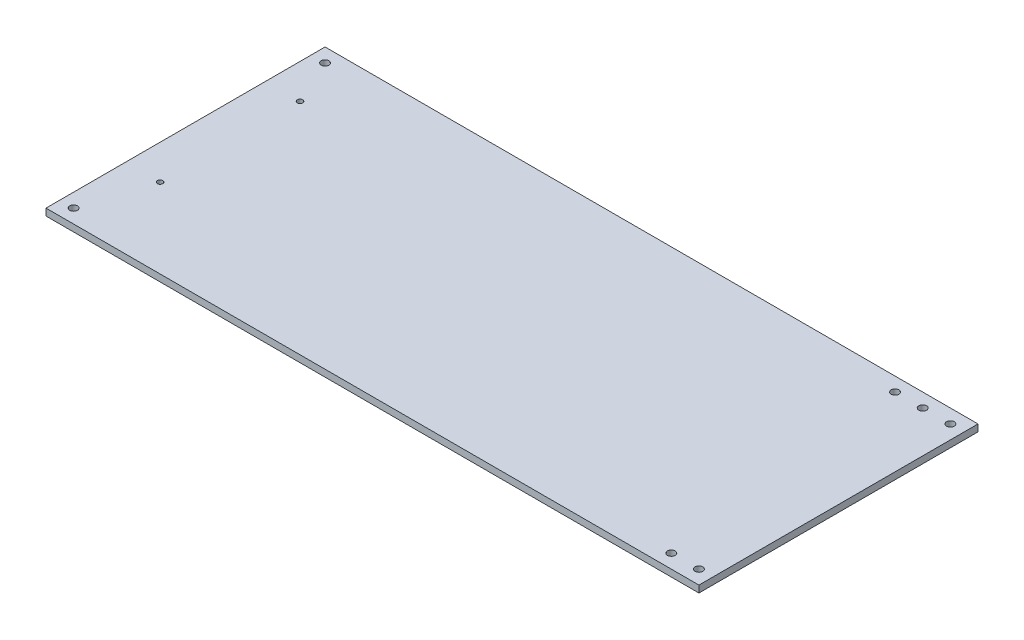
ISO-10303-21;
HEADER;
FILE_DESCRIPTION(('STEP AP214'),'2;1');
FILE_NAME('part.step','',(''),(''),'','','');
FILE_SCHEMA(('AUTOMOTIVE_DESIGN { 1 0 10303 214 1 1 1 1 }'));
ENDSEC;
DATA;
#1=APPLICATION_CONTEXT('core data for automotive mechanical design processes');
#2=APPLICATION_PROTOCOL_DEFINITION('international standard','automotive_design',2000,#1);
#3=PRODUCT_CONTEXT('',#1,'mechanical');
#4=PRODUCT('Part','Part','',(#3));
#5=PRODUCT_RELATED_PRODUCT_CATEGORY('part','',(#4));
#6=PRODUCT_DEFINITION_FORMATION('','',#4);
#7=PRODUCT_DEFINITION_CONTEXT('part definition',#1,'design');
#8=PRODUCT_DEFINITION('design','',#6,#7);
#9=PRODUCT_DEFINITION_SHAPE('','',#8);
#10=(LENGTH_UNIT() NAMED_UNIT(*) SI_UNIT(.MILLI.,.METRE.));
#11=(NAMED_UNIT(*) PLANE_ANGLE_UNIT() SI_UNIT($,.RADIAN.));
#12=(NAMED_UNIT(*) SI_UNIT($,.STERADIAN.) SOLID_ANGLE_UNIT());
#13=UNCERTAINTY_MEASURE_WITH_UNIT(LENGTH_MEASURE(1.E-05),#10,'distance_accuracy_value','');
#14=(GEOMETRIC_REPRESENTATION_CONTEXT(3) GLOBAL_UNCERTAINTY_ASSIGNED_CONTEXT((#13)) GLOBAL_UNIT_ASSIGNED_CONTEXT((#10,
#11,#12)) REPRESENTATION_CONTEXT('',''));
#15=CARTESIAN_POINT('',(0.,0.,0.));
#16=DIRECTION('',(0.,0.,1.));
#17=DIRECTION('',(1.,0.,0.));
#18=AXIS2_PLACEMENT_3D('',#15,#16,#17);
#19=CARTESIAN_POINT('',(0.,25.4,-150.));
#20=DIRECTION('',(0.,0.,1.));
#21=DIRECTION('',(1.,0.,0.));
#22=AXIS2_PLACEMENT_3D('',#19,#20,#21);
#23=PLANE('',#22);
#24=DIRECTION('',(-1.,0.,0.));
#25=VECTOR('',#24,1.);
#26=CARTESIAN_POINT('',(0.,19.05,-150.));
#27=LINE('',#26,#25);
#28=CARTESIAN_POINT('',(300.,19.05,-150.));
#29=VERTEX_POINT('',#28);
#30=CARTESIAN_POINT('',(-300.,19.05,-150.));
#31=VERTEX_POINT('',#30);
#32=EDGE_CURVE('E110',#29,#31,#27,.T.);
#33=ORIENTED_EDGE('',*,*,#32,.F.);
#34=DIRECTION('',(0.,-1.,0.));
#35=VECTOR('',#34,1.);
#36=CARTESIAN_POINT('',(300.,25.4,-150.));
#37=LINE('',#36,#35);
#38=CARTESIAN_POINT('',(300.,25.4,-150.));
#39=VERTEX_POINT('',#38);
#40=EDGE_CURVE('E11',#39,#29,#37,.T.);
#41=ORIENTED_EDGE('',*,*,#40,.F.);
#42=DIRECTION('',(-1.,0.,0.));
#43=VECTOR('',#42,1.);
#44=CARTESIAN_POINT('',(0.,25.4,-150.));
#45=LINE('',#44,#43);
#46=CARTESIAN_POINT('',(-300.,25.4,-150.));
#47=VERTEX_POINT('',#46);
#48=EDGE_CURVE('E95',#39,#47,#45,.T.);
#49=ORIENTED_EDGE('',*,*,#48,.T.);
#50=DIRECTION('',(0.,-1.,0.));
#51=VECTOR('',#50,1.);
#52=CARTESIAN_POINT('',(-300.,25.4,-150.));
#53=LINE('',#52,#51);
#54=EDGE_CURVE('E58',#47,#31,#53,.T.);
#55=ORIENTED_EDGE('',*,*,#54,.T.);
#56=EDGE_LOOP('',(#33,#41,#49,#55));
#57=FACE_BOUND('',#56,.T.);
#58=ADVANCED_FACE('F42',(#57),#23,.T.);
#59=CARTESIAN_POINT('',(300.,25.4,0.));
#60=DIRECTION('',(-1.,0.,0.));
#61=DIRECTION('',(0.,0.,1.));
#62=AXIS2_PLACEMENT_3D('',#59,#60,#61);
#63=PLANE('',#62);
#64=DIRECTION('',(0.,0.,-1.));
#65=VECTOR('',#64,1.);
#66=CARTESIAN_POINT('',(300.,19.05,0.));
#67=LINE('',#66,#65);
#68=CARTESIAN_POINT('',(300.,19.05,-406.45));
#69=VERTEX_POINT('',#68);
#70=EDGE_CURVE('E96',#29,#69,#67,.T.);
#71=ORIENTED_EDGE('',*,*,#70,.T.);
#72=DIRECTION('',(0.,-1.,0.));
#73=VECTOR('',#72,1.);
#74=CARTESIAN_POINT('',(300.,25.4,-406.45));
#75=LINE('',#74,#73);
#76=CARTESIAN_POINT('',(300.,25.4,-406.45));
#77=VERTEX_POINT('',#76);
#78=EDGE_CURVE('E55',#77,#69,#75,.T.);
#79=ORIENTED_EDGE('',*,*,#78,.F.);
#80=DIRECTION('',(0.,0.,-1.));
#81=VECTOR('',#80,1.);
#82=CARTESIAN_POINT('',(300.,25.4,0.));
#83=LINE('',#82,#81);
#84=EDGE_CURVE('E86',#39,#77,#83,.T.);
#85=ORIENTED_EDGE('',*,*,#84,.F.);
#86=ORIENTED_EDGE('',*,*,#40,.T.);
#87=EDGE_LOOP('',(#71,#79,#85,#86));
#88=FACE_BOUND('',#87,.T.);
#89=ADVANCED_FACE('F98',(#88),#63,.F.);
#90=CARTESIAN_POINT('',(0.,25.4,-406.45));
#91=DIRECTION('',(0.,0.,-1.));
#92=DIRECTION('',(-1.,0.,0.));
#93=AXIS2_PLACEMENT_3D('',#90,#91,#92);
#94=PLANE('',#93);
#95=DIRECTION('',(1.,0.,0.));
#96=VECTOR('',#95,1.);
#97=CARTESIAN_POINT('',(0.,19.05,-406.45));
#98=LINE('',#97,#96);
#99=CARTESIAN_POINT('',(-300.,19.05,-406.45));
#100=VERTEX_POINT('',#99);
#101=EDGE_CURVE('E111',#100,#69,#98,.T.);
#102=ORIENTED_EDGE('',*,*,#101,.F.);
#103=DIRECTION('',(0.,-1.,0.));
#104=VECTOR('',#103,1.);
#105=CARTESIAN_POINT('',(-300.,25.4,-406.45));
#106=LINE('',#105,#104);
#107=CARTESIAN_POINT('',(-300.,25.4,-406.45));
#108=VERTEX_POINT('',#107);
#109=EDGE_CURVE('E71',#108,#100,#106,.T.);
#110=ORIENTED_EDGE('',*,*,#109,.F.);
#111=DIRECTION('',(1.,0.,0.));
#112=VECTOR('',#111,1.);
#113=CARTESIAN_POINT('',(0.,25.4,-406.45));
#114=LINE('',#113,#112);
#115=EDGE_CURVE('E93',#108,#77,#114,.T.);
#116=ORIENTED_EDGE('',*,*,#115,.T.);
#117=ORIENTED_EDGE('',*,*,#78,.T.);
#118=EDGE_LOOP('',(#102,#110,#116,#117));
#119=FACE_BOUND('',#118,.T.);
#120=ADVANCED_FACE('F103',(#119),#94,.T.);
#121=CARTESIAN_POINT('',(-300.,25.4,0.));
#122=DIRECTION('',(-1.,0.,0.));
#123=DIRECTION('',(0.,0.,1.));
#124=AXIS2_PLACEMENT_3D('',#121,#122,#123);
#125=PLANE('',#124);
#126=DIRECTION('',(0.,0.,-1.));
#127=VECTOR('',#126,1.);
#128=CARTESIAN_POINT('',(-300.,19.05,0.));
#129=LINE('',#128,#127);
#130=EDGE_CURVE('E113',#31,#100,#129,.T.);
#131=ORIENTED_EDGE('',*,*,#130,.F.);
#132=ORIENTED_EDGE('',*,*,#54,.F.);
#133=DIRECTION('',(0.,0.,-1.));
#134=VECTOR('',#133,1.);
#135=CARTESIAN_POINT('',(-300.,25.4,0.));
#136=LINE('',#135,#134);
#137=EDGE_CURVE('E105',#47,#108,#136,.T.);
#138=ORIENTED_EDGE('',*,*,#137,.T.);
#139=ORIENTED_EDGE('',*,*,#109,.T.);
#140=EDGE_LOOP('',(#131,#132,#138,#139));
#141=FACE_BOUND('',#140,.T.);
#142=ADVANCED_FACE('F178',(#141),#125,.T.);
#143=CARTESIAN_POINT('',(0.,25.4,0.));
#144=DIRECTION('',(0.,1.,0.));
#145=DIRECTION('',(0.,0.,1.));
#146=AXIS2_PLACEMENT_3D('',#143,#144,#145);
#147=PLANE('',#146);
#148=CARTESIAN_POINT('',(-268.25,25.4,-351.68125));
#149=DIRECTION('',(0.,1.,0.));
#150=DIRECTION('',(0.,0.,1.));
#151=AXIS2_PLACEMENT_3D('',#148,#149,#150);
#152=CIRCLE('',#151,2.48920000000002);
#153=CARTESIAN_POINT('',(-268.25,25.4,-349.19205));
#154=VERTEX_POINT('',#153);
#155=EDGE_CURVE('E169',#154,#154,#152,.T.);
#156=ORIENTED_EDGE('',*,*,#155,.F.);
#157=EDGE_LOOP('',(#156));
#158=FACE_BOUND('',#157,.T.);
#159=CARTESIAN_POINT('',(-268.25,25.4,-223.09375));
#160=DIRECTION('',(0.,1.,0.));
#161=DIRECTION('',(0.,0.,1.));
#162=AXIS2_PLACEMENT_3D('',#159,#160,#161);
#163=CIRCLE('',#162,2.48920000000002);
#164=CARTESIAN_POINT('',(-268.25,25.4,-220.60455));
#165=VERTEX_POINT('',#164);
#166=EDGE_CURVE('E161',#165,#165,#163,.T.);
#167=ORIENTED_EDGE('',*,*,#166,.F.);
#168=EDGE_LOOP('',(#167));
#169=FACE_BOUND('',#168,.T.);
#170=CARTESIAN_POINT('',(-287.3,25.4,-393.75));
#171=DIRECTION('',(0.,1.,0.));
#172=DIRECTION('',(0.,0.,1.));
#173=AXIS2_PLACEMENT_3D('',#170,#171,#172);
#174=CIRCLE('',#173,3.56869999999998);
#175=CARTESIAN_POINT('',(-287.3,25.4,-390.1813));
#176=VERTEX_POINT('',#175);
#177=EDGE_CURVE('E160',#176,#176,#174,.T.);
#178=ORIENTED_EDGE('',*,*,#177,.F.);
#179=EDGE_LOOP('',(#178));
#180=FACE_BOUND('',#179,.T.);
#181=CARTESIAN_POINT('',(-287.3,25.4,-162.7));
#182=DIRECTION('',(0.,1.,0.));
#183=DIRECTION('',(0.,0.,1.));
#184=AXIS2_PLACEMENT_3D('',#181,#182,#183);
#185=CIRCLE('',#184,3.56869999999998);
#186=CARTESIAN_POINT('',(-287.3,25.4,-159.1313));
#187=VERTEX_POINT('',#186);
#188=EDGE_CURVE('E151',#187,#187,#185,.T.);
#189=ORIENTED_EDGE('',*,*,#188,.F.);
#190=EDGE_LOOP('',(#189));
#191=FACE_BOUND('',#190,.T.);
#192=CARTESIAN_POINT('',(261.9,25.4,-162.7));
#193=DIRECTION('',(0.,1.,0.));
#194=DIRECTION('',(0.,0.,1.));
#195=AXIS2_PLACEMENT_3D('',#192,#193,#194);
#196=CIRCLE('',#195,3.56869999999998);
#197=CARTESIAN_POINT('',(261.9,25.4,-159.1313));
#198=VERTEX_POINT('',#197);
#199=EDGE_CURVE('E143',#198,#198,#196,.T.);
#200=ORIENTED_EDGE('',*,*,#199,.F.);
#201=EDGE_LOOP('',(#200));
#202=FACE_BOUND('',#201,.T.);
#203=CARTESIAN_POINT('',(287.3,25.4,-162.7));
#204=DIRECTION('',(0.,1.,0.));
#205=DIRECTION('',(0.,0.,1.));
#206=AXIS2_PLACEMENT_3D('',#203,#204,#205);
#207=CIRCLE('',#206,3.56869999999998);
#208=CARTESIAN_POINT('',(287.3,25.4,-159.1313));
#209=VERTEX_POINT('',#208);
#210=EDGE_CURVE('E139',#209,#209,#207,.T.);
#211=ORIENTED_EDGE('',*,*,#210,.F.);
#212=EDGE_LOOP('',(#211));
#213=FACE_BOUND('',#212,.T.);
#214=CARTESIAN_POINT('',(236.5,25.4,-393.75));
#215=DIRECTION('',(0.,1.,0.));
#216=DIRECTION('',(0.,0.,1.));
#217=AXIS2_PLACEMENT_3D('',#214,#215,#216);
#218=CIRCLE('',#217,3.56869999999998);
#219=CARTESIAN_POINT('',(236.5,25.4,-390.1813));
#220=VERTEX_POINT('',#219);
#221=EDGE_CURVE('E132',#220,#220,#218,.T.);
#222=ORIENTED_EDGE('',*,*,#221,.F.);
#223=EDGE_LOOP('',(#222));
#224=FACE_BOUND('',#223,.T.);
#225=CARTESIAN_POINT('',(261.9,25.4,-393.75));
#226=DIRECTION('',(0.,1.,0.));
#227=DIRECTION('',(0.,0.,1.));
#228=AXIS2_PLACEMENT_3D('',#225,#226,#227);
#229=CIRCLE('',#228,3.56869999999998);
#230=CARTESIAN_POINT('',(261.9,25.4,-390.1813));
#231=VERTEX_POINT('',#230);
#232=EDGE_CURVE('E126',#231,#231,#229,.T.);
#233=ORIENTED_EDGE('',*,*,#232,.F.);
#234=EDGE_LOOP('',(#233));
#235=FACE_BOUND('',#234,.T.);
#236=CARTESIAN_POINT('',(287.3,25.4,-393.75));
#237=DIRECTION('',(0.,1.,0.));
#238=DIRECTION('',(0.,0.,1.));
#239=AXIS2_PLACEMENT_3D('',#236,#237,#238);
#240=CIRCLE('',#239,3.56869999999998);
#241=CARTESIAN_POINT('',(287.3,25.4,-390.1813));
#242=VERTEX_POINT('',#241);
#243=EDGE_CURVE('E122',#242,#242,#240,.T.);
#244=ORIENTED_EDGE('',*,*,#243,.F.);
#245=EDGE_LOOP('',(#244));
#246=FACE_BOUND('',#245,.T.);
#247=ORIENTED_EDGE('',*,*,#48,.F.);
#248=ORIENTED_EDGE('',*,*,#84,.T.);
#249=ORIENTED_EDGE('',*,*,#115,.F.);
#250=ORIENTED_EDGE('',*,*,#137,.F.);
#251=EDGE_LOOP('',(#247,#248,#249,#250));
#252=FACE_BOUND('',#251,.T.);
#253=ADVANCED_FACE('F87',(#158,#169,#180,#191,#202,#213,#224,#235,#246,#252),#147,.T.);
#254=CARTESIAN_POINT('',(0.,19.05,0.));
#255=DIRECTION('',(0.,1.,0.));
#256=DIRECTION('',(0.,0.,1.));
#257=AXIS2_PLACEMENT_3D('',#254,#255,#256);
#258=PLANE('',#257);
#259=CARTESIAN_POINT('',(-268.25,19.05,-351.68125));
#260=DIRECTION('',(0.,1.,0.));
#261=DIRECTION('',(0.,0.,1.));
#262=AXIS2_PLACEMENT_3D('',#259,#260,#261);
#263=CIRCLE('',#262,2.48920000000002);
#264=CARTESIAN_POINT('',(-268.25,19.05,-349.19205));
#265=VERTEX_POINT('',#264);
#266=EDGE_CURVE('E168',#265,#265,#263,.T.);
#267=ORIENTED_EDGE('',*,*,#266,.T.);
#268=EDGE_LOOP('',(#267));
#269=FACE_BOUND('',#268,.T.);
#270=CARTESIAN_POINT('',(-268.25,19.05,-223.09375));
#271=DIRECTION('',(0.,1.,0.));
#272=DIRECTION('',(0.,0.,1.));
#273=AXIS2_PLACEMENT_3D('',#270,#271,#272);
#274=CIRCLE('',#273,2.48920000000002);
#275=CARTESIAN_POINT('',(-268.25,19.05,-220.60455));
#276=VERTEX_POINT('',#275);
#277=EDGE_CURVE('E157',#276,#276,#274,.T.);
#278=ORIENTED_EDGE('',*,*,#277,.T.);
#279=EDGE_LOOP('',(#278));
#280=FACE_BOUND('',#279,.T.);
#281=CARTESIAN_POINT('',(-287.3,19.05,-393.75));
#282=DIRECTION('',(0.,1.,0.));
#283=DIRECTION('',(0.,0.,1.));
#284=AXIS2_PLACEMENT_3D('',#281,#282,#283);
#285=CIRCLE('',#284,3.56869999999998);
#286=CARTESIAN_POINT('',(-287.3,19.05,-390.1813));
#287=VERTEX_POINT('',#286);
#288=EDGE_CURVE('E153',#287,#287,#285,.T.);
#289=ORIENTED_EDGE('',*,*,#288,.T.);
#290=EDGE_LOOP('',(#289));
#291=FACE_BOUND('',#290,.T.);
#292=CARTESIAN_POINT('',(-287.3,19.05,-162.7));
#293=DIRECTION('',(0.,1.,0.));
#294=DIRECTION('',(0.,0.,1.));
#295=AXIS2_PLACEMENT_3D('',#292,#293,#294);
#296=CIRCLE('',#295,3.56869999999998);
#297=CARTESIAN_POINT('',(-287.3,19.05,-159.1313));
#298=VERTEX_POINT('',#297);
#299=EDGE_CURVE('E150',#298,#298,#296,.T.);
#300=ORIENTED_EDGE('',*,*,#299,.T.);
#301=EDGE_LOOP('',(#300));
#302=FACE_BOUND('',#301,.T.);
#303=CARTESIAN_POINT('',(261.9,19.05,-162.7));
#304=DIRECTION('',(0.,1.,0.));
#305=DIRECTION('',(0.,0.,1.));
#306=AXIS2_PLACEMENT_3D('',#303,#304,#305);
#307=CIRCLE('',#306,3.56869999999998);
#308=CARTESIAN_POINT('',(261.9,19.05,-159.1313));
#309=VERTEX_POINT('',#308);
#310=EDGE_CURVE('E145',#309,#309,#307,.T.);
#311=ORIENTED_EDGE('',*,*,#310,.T.);
#312=EDGE_LOOP('',(#311));
#313=FACE_BOUND('',#312,.T.);
#314=CARTESIAN_POINT('',(287.3,19.05,-162.7));
#315=DIRECTION('',(0.,1.,0.));
#316=DIRECTION('',(0.,0.,1.));
#317=AXIS2_PLACEMENT_3D('',#314,#315,#316);
#318=CIRCLE('',#317,3.56869999999998);
#319=CARTESIAN_POINT('',(287.3,19.05,-159.1313));
#320=VERTEX_POINT('',#319);
#321=EDGE_CURVE('E138',#320,#320,#318,.T.);
#322=ORIENTED_EDGE('',*,*,#321,.T.);
#323=EDGE_LOOP('',(#322));
#324=FACE_BOUND('',#323,.T.);
#325=CARTESIAN_POINT('',(236.5,19.05,-393.75));
#326=DIRECTION('',(0.,1.,0.));
#327=DIRECTION('',(0.,0.,1.));
#328=AXIS2_PLACEMENT_3D('',#325,#326,#327);
#329=CIRCLE('',#328,3.56870000000001);
#330=CARTESIAN_POINT('',(236.5,19.05,-390.1813));
#331=VERTEX_POINT('',#330);
#332=EDGE_CURVE('E127',#331,#331,#329,.T.);
#333=ORIENTED_EDGE('',*,*,#332,.T.);
#334=EDGE_LOOP('',(#333));
#335=FACE_BOUND('',#334,.T.);
#336=CARTESIAN_POINT('',(261.9,19.05,-393.75));
#337=DIRECTION('',(0.,1.,0.));
#338=DIRECTION('',(0.,0.,1.));
#339=AXIS2_PLACEMENT_3D('',#336,#337,#338);
#340=CIRCLE('',#339,3.56869999999998);
#341=CARTESIAN_POINT('',(261.9,19.05,-390.1813));
#342=VERTEX_POINT('',#341);
#343=EDGE_CURVE('E121',#342,#342,#340,.T.);
#344=ORIENTED_EDGE('',*,*,#343,.T.);
#345=EDGE_LOOP('',(#344));
#346=FACE_BOUND('',#345,.T.);
#347=CARTESIAN_POINT('',(287.3,19.05,-393.75));
#348=DIRECTION('',(0.,1.,0.));
#349=DIRECTION('',(0.,0.,1.));
#350=AXIS2_PLACEMENT_3D('',#347,#348,#349);
#351=CIRCLE('',#350,3.56869999999998);
#352=CARTESIAN_POINT('',(287.3,19.05,-390.1813));
#353=VERTEX_POINT('',#352);
#354=EDGE_CURVE('E107',#353,#353,#351,.T.);
#355=ORIENTED_EDGE('',*,*,#354,.T.);
#356=EDGE_LOOP('',(#355));
#357=FACE_BOUND('',#356,.T.);
#358=ORIENTED_EDGE('',*,*,#32,.T.);
#359=ORIENTED_EDGE('',*,*,#130,.T.);
#360=ORIENTED_EDGE('',*,*,#101,.T.);
#361=ORIENTED_EDGE('',*,*,#70,.F.);
#362=EDGE_LOOP('',(#358,#359,#360,#361));
#363=FACE_BOUND('',#362,.T.);
#364=ADVANCED_FACE('F180',(#269,#280,#291,#302,#313,#324,#335,#346,#357,#363),#258,.F.);
#365=CARTESIAN_POINT('',(287.3,25.4,-393.75));
#366=DIRECTION('',(0.,1.,0.));
#367=DIRECTION('',(0.,0.,1.));
#368=AXIS2_PLACEMENT_3D('',#365,#366,#367);
#369=CYLINDRICAL_SURFACE('',#368,3.56869999999998);
#370=ORIENTED_EDGE('',*,*,#354,.F.);
#371=EDGE_LOOP('',(#370));
#372=FACE_BOUND('',#371,.T.);
#373=ORIENTED_EDGE('',*,*,#243,.T.);
#374=EDGE_LOOP('',(#373));
#375=FACE_BOUND('',#374,.T.);
#376=ADVANCED_FACE('F196',(#372,#375),#369,.F.);
#377=CARTESIAN_POINT('',(261.9,25.4,-393.75));
#378=DIRECTION('',(0.,1.,0.));
#379=DIRECTION('',(0.,0.,1.));
#380=AXIS2_PLACEMENT_3D('',#377,#378,#379);
#381=CYLINDRICAL_SURFACE('',#380,3.56869999999998);
#382=ORIENTED_EDGE('',*,*,#343,.F.);
#383=EDGE_LOOP('',(#382));
#384=FACE_BOUND('',#383,.T.);
#385=ORIENTED_EDGE('',*,*,#232,.T.);
#386=EDGE_LOOP('',(#385));
#387=FACE_BOUND('',#386,.T.);
#388=ADVANCED_FACE('F197',(#384,#387),#381,.F.);
#389=CARTESIAN_POINT('',(236.5,25.4,-393.75));
#390=DIRECTION('',(0.,1.,0.));
#391=DIRECTION('',(0.,0.,1.));
#392=AXIS2_PLACEMENT_3D('',#389,#390,#391);
#393=CYLINDRICAL_SURFACE('',#392,3.56869999999999);
#394=ORIENTED_EDGE('',*,*,#332,.F.);
#395=EDGE_LOOP('',(#394));
#396=FACE_BOUND('',#395,.T.);
#397=ORIENTED_EDGE('',*,*,#221,.T.);
#398=EDGE_LOOP('',(#397));
#399=FACE_BOUND('',#398,.T.);
#400=ADVANCED_FACE('F202',(#396,#399),#393,.F.);
#401=CARTESIAN_POINT('',(287.3,25.4,-162.7));
#402=DIRECTION('',(0.,1.,0.));
#403=DIRECTION('',(0.,0.,1.));
#404=AXIS2_PLACEMENT_3D('',#401,#402,#403);
#405=CYLINDRICAL_SURFACE('',#404,3.56869999999998);
#406=ORIENTED_EDGE('',*,*,#321,.F.);
#407=EDGE_LOOP('',(#406));
#408=FACE_BOUND('',#407,.T.);
#409=ORIENTED_EDGE('',*,*,#210,.T.);
#410=EDGE_LOOP('',(#409));
#411=FACE_BOUND('',#410,.T.);
#412=ADVANCED_FACE('F264',(#408,#411),#405,.F.);
#413=CARTESIAN_POINT('',(261.9,25.4,-162.7));
#414=DIRECTION('',(0.,1.,0.));
#415=DIRECTION('',(0.,0.,1.));
#416=AXIS2_PLACEMENT_3D('',#413,#414,#415);
#417=CYLINDRICAL_SURFACE('',#416,3.56869999999998);
#418=ORIENTED_EDGE('',*,*,#310,.F.);
#419=EDGE_LOOP('',(#418));
#420=FACE_BOUND('',#419,.T.);
#421=ORIENTED_EDGE('',*,*,#199,.T.);
#422=EDGE_LOOP('',(#421));
#423=FACE_BOUND('',#422,.T.);
#424=ADVANCED_FACE('F274',(#420,#423),#417,.F.);
#425=CARTESIAN_POINT('',(-287.3,25.4,-162.7));
#426=DIRECTION('',(0.,1.,0.));
#427=DIRECTION('',(0.,0.,1.));
#428=AXIS2_PLACEMENT_3D('',#425,#426,#427);
#429=CYLINDRICAL_SURFACE('',#428,3.56869999999998);
#430=ORIENTED_EDGE('',*,*,#299,.F.);
#431=EDGE_LOOP('',(#430));
#432=FACE_BOUND('',#431,.T.);
#433=ORIENTED_EDGE('',*,*,#188,.T.);
#434=EDGE_LOOP('',(#433));
#435=FACE_BOUND('',#434,.T.);
#436=ADVANCED_FACE('F282',(#432,#435),#429,.F.);
#437=CARTESIAN_POINT('',(-287.3,25.4,-393.75));
#438=DIRECTION('',(0.,1.,0.));
#439=DIRECTION('',(0.,0.,1.));
#440=AXIS2_PLACEMENT_3D('',#437,#438,#439);
#441=CYLINDRICAL_SURFACE('',#440,3.56869999999998);
#442=ORIENTED_EDGE('',*,*,#288,.F.);
#443=EDGE_LOOP('',(#442));
#444=FACE_BOUND('',#443,.T.);
#445=ORIENTED_EDGE('',*,*,#177,.T.);
#446=EDGE_LOOP('',(#445));
#447=FACE_BOUND('',#446,.T.);
#448=ADVANCED_FACE('F292',(#444,#447),#441,.F.);
#449=CARTESIAN_POINT('',(-268.25,25.4,-223.09375));
#450=DIRECTION('',(0.,1.,0.));
#451=DIRECTION('',(0.,0.,1.));
#452=AXIS2_PLACEMENT_3D('',#449,#450,#451);
#453=CYLINDRICAL_SURFACE('',#452,2.48920000000002);
#454=ORIENTED_EDGE('',*,*,#277,.F.);
#455=EDGE_LOOP('',(#454));
#456=FACE_BOUND('',#455,.T.);
#457=ORIENTED_EDGE('',*,*,#166,.T.);
#458=EDGE_LOOP('',(#457));
#459=FACE_BOUND('',#458,.T.);
#460=ADVANCED_FACE('F301',(#456,#459),#453,.F.);
#461=CARTESIAN_POINT('',(-268.25,25.4,-351.68125));
#462=DIRECTION('',(0.,1.,0.));
#463=DIRECTION('',(0.,0.,1.));
#464=AXIS2_PLACEMENT_3D('',#461,#462,#463);
#465=CYLINDRICAL_SURFACE('',#464,2.48920000000002);
#466=ORIENTED_EDGE('',*,*,#266,.F.);
#467=EDGE_LOOP('',(#466));
#468=FACE_BOUND('',#467,.T.);
#469=ORIENTED_EDGE('',*,*,#155,.T.);
#470=EDGE_LOOP('',(#469));
#471=FACE_BOUND('',#470,.T.);
#472=ADVANCED_FACE('F173',(#468,#471),#465,.F.);
#473=CLOSED_SHELL('',(#58,#89,#120,#142,#253,#364,#376,#388,#400,#412,#424,#436,#448,#460,#472));
#474=MANIFOLD_SOLID_BREP('B2',#473);
#475=ADVANCED_BREP_SHAPE_REPRESENTATION('',(#18,#474),#14);
#476=SHAPE_DEFINITION_REPRESENTATION(#9,#475);
ENDSEC;
END-ISO-10303-21;
